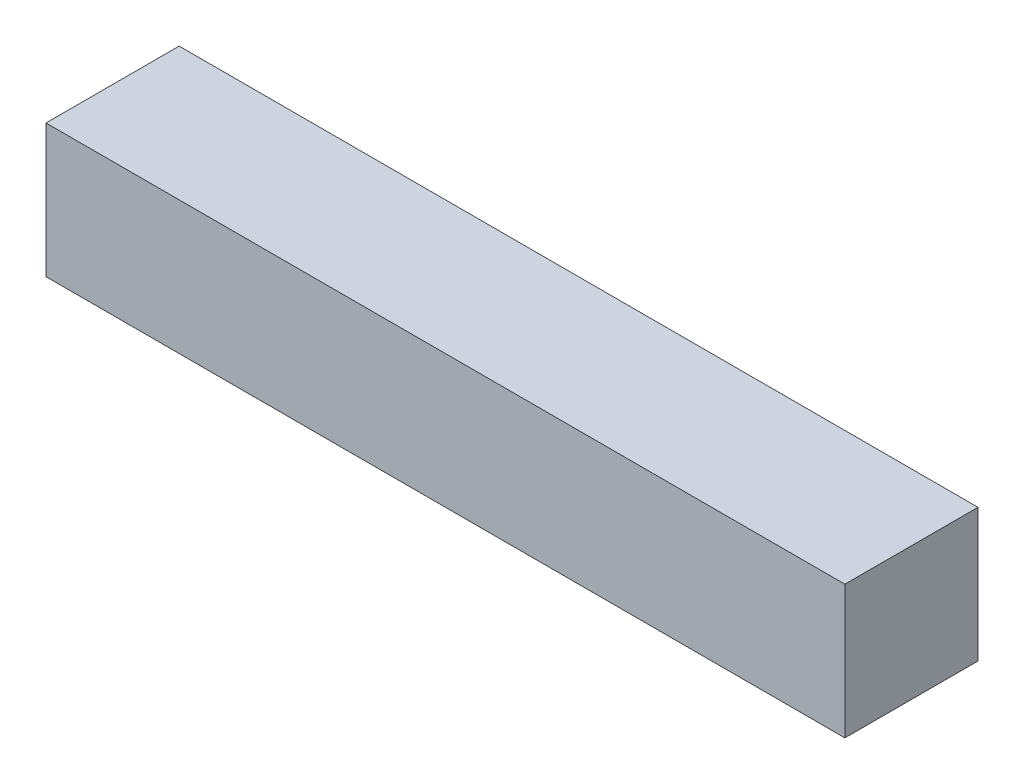
ISO-10303-21;
HEADER;
FILE_DESCRIPTION(('STEP AP214'),'2;1');
FILE_NAME('part.step','',(''),(''),'','','');
FILE_SCHEMA(('AUTOMOTIVE_DESIGN { 1 0 10303 214 1 1 1 1 }'));
ENDSEC;
DATA;
#1=APPLICATION_CONTEXT('core data for automotive mechanical design processes');
#2=APPLICATION_PROTOCOL_DEFINITION('international standard','automotive_design',2000,#1);
#3=PRODUCT_CONTEXT('',#1,'mechanical');
#4=PRODUCT('Part','Part','',(#3));
#5=PRODUCT_RELATED_PRODUCT_CATEGORY('part','',(#4));
#6=PRODUCT_DEFINITION_FORMATION('','',#4);
#7=PRODUCT_DEFINITION_CONTEXT('part definition',#1,'design');
#8=PRODUCT_DEFINITION('design','',#6,#7);
#9=PRODUCT_DEFINITION_SHAPE('','',#8);
#10=(LENGTH_UNIT() NAMED_UNIT(*) SI_UNIT(.MILLI.,.METRE.));
#11=(NAMED_UNIT(*) PLANE_ANGLE_UNIT() SI_UNIT($,.RADIAN.));
#12=(NAMED_UNIT(*) SI_UNIT($,.STERADIAN.) SOLID_ANGLE_UNIT());
#13=UNCERTAINTY_MEASURE_WITH_UNIT(LENGTH_MEASURE(1.E-05),#10,'distance_accuracy_value','');
#14=(GEOMETRIC_REPRESENTATION_CONTEXT(3) GLOBAL_UNCERTAINTY_ASSIGNED_CONTEXT((#13)) GLOBAL_UNIT_ASSIGNED_CONTEXT((#10,
#11,#12)) REPRESENTATION_CONTEXT('',''));
#15=CARTESIAN_POINT('',(0.,0.,0.));
#16=DIRECTION('',(0.,0.,1.));
#17=DIRECTION('',(1.,0.,0.));
#18=AXIS2_PLACEMENT_3D('',#15,#16,#17);
#19=CARTESIAN_POINT('',(60.,5.,-5.));
#20=DIRECTION('',(0.,0.,1.));
#21=DIRECTION('',(1.,0.,0.));
#22=AXIS2_PLACEMENT_3D('',#19,#20,#21);
#23=PLANE('',#22);
#24=DIRECTION('',(0.,1.,0.));
#25=VECTOR('',#24,1.);
#26=CARTESIAN_POINT('',(0.,5.,-5.));
#27=LINE('',#26,#25);
#28=CARTESIAN_POINT('',(0.,-5.,-5.));
#29=VERTEX_POINT('',#28);
#30=CARTESIAN_POINT('',(0.,5.,-5.));
#31=VERTEX_POINT('',#30);
#32=EDGE_CURVE('E107',#29,#31,#27,.T.);
#33=ORIENTED_EDGE('',*,*,#32,.T.);
#34=DIRECTION('',(-1.,0.,0.));
#35=VECTOR('',#34,1.);
#36=CARTESIAN_POINT('',(60.,5.,-5.));
#37=LINE('',#36,#35);
#38=CARTESIAN_POINT('',(60.,5.,-5.));
#39=VERTEX_POINT('',#38);
#40=EDGE_CURVE('E11',#39,#31,#37,.T.);
#41=ORIENTED_EDGE('',*,*,#40,.F.);
#42=DIRECTION('',(0.,1.,0.));
#43=VECTOR('',#42,1.);
#44=CARTESIAN_POINT('',(60.,5.,-5.));
#45=LINE('',#44,#43);
#46=CARTESIAN_POINT('',(60.,-5.,-5.));
#47=VERTEX_POINT('',#46);
#48=EDGE_CURVE('E91',#47,#39,#45,.T.);
#49=ORIENTED_EDGE('',*,*,#48,.F.);
#50=DIRECTION('',(-1.,0.,0.));
#51=VECTOR('',#50,1.);
#52=CARTESIAN_POINT('',(60.,-5.,-5.));
#53=LINE('',#52,#51);
#54=EDGE_CURVE('E103',#47,#29,#53,.T.);
#55=ORIENTED_EDGE('',*,*,#54,.T.);
#56=EDGE_LOOP('',(#33,#41,#49,#55));
#57=FACE_BOUND('',#56,.T.);
#58=ADVANCED_FACE('F39',(#57),#23,.F.);
#59=CARTESIAN_POINT('',(60.,5.,5.));
#60=DIRECTION('',(0.,-1.,0.));
#61=DIRECTION('',(0.,0.,-1.));
#62=AXIS2_PLACEMENT_3D('',#59,#60,#61);
#63=PLANE('',#62);
#64=DIRECTION('',(0.,0.,1.));
#65=VECTOR('',#64,1.);
#66=CARTESIAN_POINT('',(0.,5.,5.));
#67=LINE('',#66,#65);
#68=CARTESIAN_POINT('',(0.,5.,5.));
#69=VERTEX_POINT('',#68);
#70=EDGE_CURVE('E96',#31,#69,#67,.T.);
#71=ORIENTED_EDGE('',*,*,#70,.T.);
#72=DIRECTION('',(-1.,0.,0.));
#73=VECTOR('',#72,1.);
#74=CARTESIAN_POINT('',(60.,5.,5.));
#75=LINE('',#74,#73);
#76=CARTESIAN_POINT('',(60.,5.,5.));
#77=VERTEX_POINT('',#76);
#78=EDGE_CURVE('E48',#77,#69,#75,.T.);
#79=ORIENTED_EDGE('',*,*,#78,.F.);
#80=DIRECTION('',(0.,0.,1.));
#81=VECTOR('',#80,1.);
#82=CARTESIAN_POINT('',(60.,5.,5.));
#83=LINE('',#82,#81);
#84=EDGE_CURVE('E86',#39,#77,#83,.T.);
#85=ORIENTED_EDGE('',*,*,#84,.F.);
#86=ORIENTED_EDGE('',*,*,#40,.T.);
#87=EDGE_LOOP('',(#71,#79,#85,#86));
#88=FACE_BOUND('',#87,.T.);
#89=ADVANCED_FACE('F95',(#88),#63,.F.);
#90=CARTESIAN_POINT('',(60.,5.,5.));
#91=DIRECTION('',(0.,0.,-1.));
#92=DIRECTION('',(0.,1.,0.));
#93=AXIS2_PLACEMENT_3D('',#90,#91,#92);
#94=PLANE('',#93);
#95=DIRECTION('',(0.,-1.,0.));
#96=VECTOR('',#95,1.);
#97=CARTESIAN_POINT('',(0.,5.,5.));
#98=LINE('',#97,#96);
#99=CARTESIAN_POINT('',(0.,-5.,5.));
#100=VERTEX_POINT('',#99);
#101=EDGE_CURVE('E73',#69,#100,#98,.T.);
#102=ORIENTED_EDGE('',*,*,#101,.T.);
#103=DIRECTION('',(-1.,0.,0.));
#104=VECTOR('',#103,1.);
#105=CARTESIAN_POINT('',(60.,-5.,5.));
#106=LINE('',#105,#104);
#107=CARTESIAN_POINT('',(60.,-5.,5.));
#108=VERTEX_POINT('',#107);
#109=EDGE_CURVE('E98',#108,#100,#106,.T.);
#110=ORIENTED_EDGE('',*,*,#109,.F.);
#111=DIRECTION('',(0.,-1.,0.));
#112=VECTOR('',#111,1.);
#113=CARTESIAN_POINT('',(60.,5.,5.));
#114=LINE('',#113,#112);
#115=EDGE_CURVE('E89',#77,#108,#114,.T.);
#116=ORIENTED_EDGE('',*,*,#115,.F.);
#117=ORIENTED_EDGE('',*,*,#78,.T.);
#118=EDGE_LOOP('',(#102,#110,#116,#117));
#119=FACE_BOUND('',#118,.T.);
#120=ADVANCED_FACE('F99',(#119),#94,.F.);
#121=CARTESIAN_POINT('',(60.,-5.,5.));
#122=DIRECTION('',(0.,1.,0.));
#123=DIRECTION('',(0.,0.,1.));
#124=AXIS2_PLACEMENT_3D('',#121,#122,#123);
#125=PLANE('',#124);
#126=DIRECTION('',(0.,0.,-1.));
#127=VECTOR('',#126,1.);
#128=CARTESIAN_POINT('',(0.,-5.,5.));
#129=LINE('',#128,#127);
#130=EDGE_CURVE('E79',#100,#29,#129,.T.);
#131=ORIENTED_EDGE('',*,*,#130,.T.);
#132=ORIENTED_EDGE('',*,*,#54,.F.);
#133=DIRECTION('',(0.,0.,-1.));
#134=VECTOR('',#133,1.);
#135=CARTESIAN_POINT('',(60.,-5.,5.));
#136=LINE('',#135,#134);
#137=EDGE_CURVE('E56',#108,#47,#136,.T.);
#138=ORIENTED_EDGE('',*,*,#137,.F.);
#139=ORIENTED_EDGE('',*,*,#109,.T.);
#140=EDGE_LOOP('',(#131,#132,#138,#139));
#141=FACE_BOUND('',#140,.T.);
#142=ADVANCED_FACE('F120',(#141),#125,.F.);
#143=CARTESIAN_POINT('',(60.,0.,0.));
#144=DIRECTION('',(1.,0.,0.));
#145=DIRECTION('',(0.,0.,-1.));
#146=AXIS2_PLACEMENT_3D('',#143,#144,#145);
#147=PLANE('',#146);
#148=ORIENTED_EDGE('',*,*,#48,.T.);
#149=ORIENTED_EDGE('',*,*,#84,.T.);
#150=ORIENTED_EDGE('',*,*,#115,.T.);
#151=ORIENTED_EDGE('',*,*,#137,.T.);
#152=EDGE_LOOP('',(#148,#149,#150,#151));
#153=FACE_BOUND('',#152,.T.);
#154=ADVANCED_FACE('F87',(#153),#147,.T.);
#155=CARTESIAN_POINT('',(0.,0.,0.));
#156=DIRECTION('',(1.,0.,0.));
#157=DIRECTION('',(0.,0.,-1.));
#158=AXIS2_PLACEMENT_3D('',#155,#156,#157);
#159=PLANE('',#158);
#160=ORIENTED_EDGE('',*,*,#32,.F.);
#161=ORIENTED_EDGE('',*,*,#130,.F.);
#162=ORIENTED_EDGE('',*,*,#101,.F.);
#163=ORIENTED_EDGE('',*,*,#70,.F.);
#164=EDGE_LOOP('',(#160,#161,#162,#163));
#165=FACE_BOUND('',#164,.T.);
#166=ADVANCED_FACE('F123',(#165),#159,.F.);
#167=CLOSED_SHELL('',(#58,#89,#120,#142,#154,#166));
#168=MANIFOLD_SOLID_BREP('B2',#167);
#169=ADVANCED_BREP_SHAPE_REPRESENTATION('',(#18,#168),#14);
#170=SHAPE_DEFINITION_REPRESENTATION(#9,#169);
ENDSEC;
END-ISO-10303-21;
